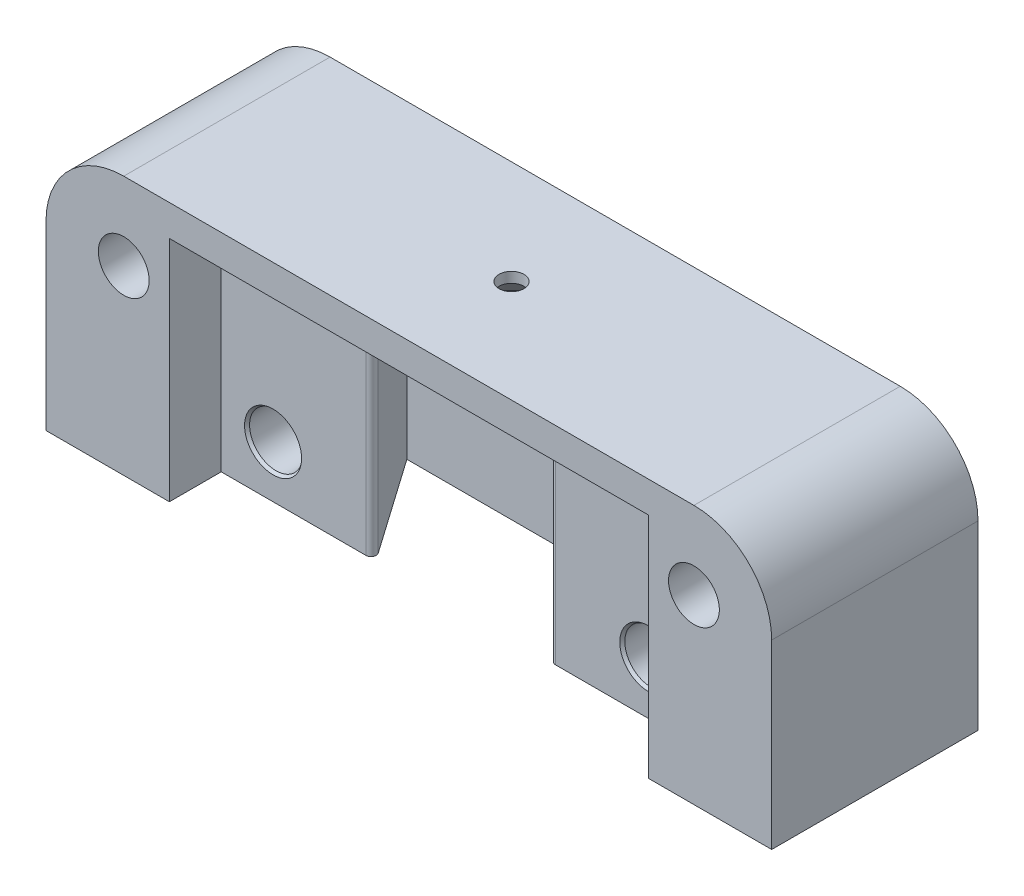
ISO-10303-21;
HEADER;
FILE_DESCRIPTION(('STEP AP214'),'2;1');
FILE_NAME('part.step','',(''),(''),'','','');
FILE_SCHEMA(('AUTOMOTIVE_DESIGN { 1 0 10303 214 1 1 1 1 }'));
ENDSEC;
DATA;
#1=APPLICATION_CONTEXT('core data for automotive mechanical design processes');
#2=APPLICATION_PROTOCOL_DEFINITION('international standard','automotive_design',2000,#1);
#3=PRODUCT_CONTEXT('',#1,'mechanical');
#4=PRODUCT('Part','Part','',(#3));
#5=PRODUCT_RELATED_PRODUCT_CATEGORY('part','',(#4));
#6=PRODUCT_DEFINITION_FORMATION('','',#4);
#7=PRODUCT_DEFINITION_CONTEXT('part definition',#1,'design');
#8=PRODUCT_DEFINITION('design','',#6,#7);
#9=PRODUCT_DEFINITION_SHAPE('','',#8);
#10=(LENGTH_UNIT() NAMED_UNIT(*) SI_UNIT(.MILLI.,.METRE.));
#11=(NAMED_UNIT(*) PLANE_ANGLE_UNIT() SI_UNIT($,.RADIAN.));
#12=(NAMED_UNIT(*) SI_UNIT($,.STERADIAN.) SOLID_ANGLE_UNIT());
#13=UNCERTAINTY_MEASURE_WITH_UNIT(LENGTH_MEASURE(1.E-05),#10,'distance_accuracy_value','');
#14=(GEOMETRIC_REPRESENTATION_CONTEXT(3) GLOBAL_UNCERTAINTY_ASSIGNED_CONTEXT((#13)) GLOBAL_UNIT_ASSIGNED_CONTEXT((#10,
#11,#12)) REPRESENTATION_CONTEXT('',''));
#15=CARTESIAN_POINT('',(0.,0.,0.));
#16=DIRECTION('',(0.,0.,1.));
#17=DIRECTION('',(1.,0.,0.));
#18=AXIS2_PLACEMENT_3D('',#15,#16,#17);
#19=CARTESIAN_POINT('',(0.,25.,4.9));
#20=DIRECTION('',(0.,0.,-1.));
#21=DIRECTION('',(-1.,0.,0.));
#22=AXIS2_PLACEMENT_3D('',#19,#20,#21);
#23=PLANE('',#22);
#24=CARTESIAN_POINT('',(18.0979246179028,5.,4.9));
#25=DIRECTION('',(0.,0.,1.));
#26=DIRECTION('',(1.,0.,0.));
#27=AXIS2_PLACEMENT_3D('',#24,#25,#26);
#28=CIRCLE('',#27,2.75);
#29=CARTESIAN_POINT('',(20.8479246179028,5.,4.9));
#30=VERTEX_POINT('',#29);
#31=EDGE_CURVE('E962',#30,#30,#28,.T.);
#32=ORIENTED_EDGE('',*,*,#31,.F.);
#33=EDGE_LOOP('',(#32));
#34=FACE_BOUND('',#33,.T.);
#35=DIRECTION('',(-1.,0.,0.));
#36=VECTOR('',#35,1.);
#37=CARTESIAN_POINT('',(0.,22.,4.9));
#38=LINE('',#37,#36);
#39=CARTESIAN_POINT('',(23.0979246179028,22.,4.9));
#40=VERTEX_POINT('',#39);
#41=CARTESIAN_POINT('',(9.15051389408554,22.,4.9));
#42=VERTEX_POINT('',#41);
#43=EDGE_CURVE('E182',#40,#42,#38,.T.);
#44=ORIENTED_EDGE('',*,*,#43,.T.);
#45=DIRECTION('',(0.,-1.,0.));
#46=VECTOR('',#45,1.);
#47=CARTESIAN_POINT('',(9.15051389408554,25.,4.9));
#48=LINE('',#47,#46);
#49=CARTESIAN_POINT('',(9.15051389408554,0.,4.9));
#50=VERTEX_POINT('',#49);
#51=EDGE_CURVE('E251',#42,#50,#48,.T.);
#52=ORIENTED_EDGE('',*,*,#51,.T.);
#53=DIRECTION('',(1.,0.,0.));
#54=VECTOR('',#53,1.);
#55=CARTESIAN_POINT('',(0.,0.,4.9));
#56=LINE('',#55,#54);
#57=CARTESIAN_POINT('',(23.0979246179028,0.,4.9));
#58=VERTEX_POINT('',#57);
#59=EDGE_CURVE('E316',#50,#58,#56,.T.);
#60=ORIENTED_EDGE('',*,*,#59,.T.);
#61=DIRECTION('',(0.,-1.,0.));
#62=VECTOR('',#61,1.);
#63=CARTESIAN_POINT('',(23.0979246179028,25.,4.9));
#64=LINE('',#63,#62);
#65=EDGE_CURVE('E212',#40,#58,#64,.T.);
#66=ORIENTED_EDGE('',*,*,#65,.F.);
#67=EDGE_LOOP('',(#44,#52,#60,#66));
#68=FACE_BOUND('',#67,.T.);
#69=ADVANCED_FACE('F44',(#34,#68),#23,.F.);
#70=CARTESIAN_POINT('',(23.0979246179028,25.,0.));
#71=DIRECTION('',(1.,0.,0.));
#72=DIRECTION('',(0.,0.,-1.));
#73=AXIS2_PLACEMENT_3D('',#70,#71,#72);
#74=PLANE('',#73);
#75=DIRECTION('',(0.,-1.,0.));
#76=VECTOR('',#75,1.);
#77=CARTESIAN_POINT('',(23.0979246179028,25.,9.9));
#78=LINE('',#77,#76);
#79=CARTESIAN_POINT('',(23.0979246179028,22.,9.9));
#80=VERTEX_POINT('',#79);
#81=CARTESIAN_POINT('',(23.0979246179028,0.,9.9));
#82=VERTEX_POINT('',#81);
#83=EDGE_CURVE('E209',#80,#82,#78,.T.);
#84=ORIENTED_EDGE('',*,*,#83,.F.);
#85=DIRECTION('',(0.,0.,-1.));
#86=VECTOR('',#85,1.);
#87=CARTESIAN_POINT('',(23.0979246179028,22.,0.));
#88=LINE('',#87,#86);
#89=EDGE_CURVE('E167',#80,#40,#88,.T.);
#90=ORIENTED_EDGE('',*,*,#89,.T.);
#91=ORIENTED_EDGE('',*,*,#65,.T.);
#92=DIRECTION('',(0.,0.,1.));
#93=VECTOR('',#92,1.);
#94=CARTESIAN_POINT('',(23.0979246179028,0.,0.));
#95=LINE('',#94,#93);
#96=EDGE_CURVE('E329',#58,#82,#95,.T.);
#97=ORIENTED_EDGE('',*,*,#96,.T.);
#98=EDGE_LOOP('',(#84,#90,#91,#97));
#99=FACE_BOUND('',#98,.T.);
#100=ADVANCED_FACE('F406',(#99),#74,.F.);
#101=CARTESIAN_POINT('',(35.,25.,0.));
#102=DIRECTION('',(-1.,0.,0.));
#103=DIRECTION('',(0.,0.,1.));
#104=AXIS2_PLACEMENT_3D('',#101,#102,#103);
#105=PLANE('',#104);
#106=DIRECTION('',(0.,-1.,0.));
#107=VECTOR('',#106,1.);
#108=CARTESIAN_POINT('',(35.,25.,-10.));
#109=LINE('',#108,#107);
#110=CARTESIAN_POINT('',(35.,17.5,-10.));
#111=VERTEX_POINT('',#110);
#112=CARTESIAN_POINT('',(35.,0.,-10.));
#113=VERTEX_POINT('',#112);
#114=EDGE_CURVE('E203',#111,#113,#109,.T.);
#115=ORIENTED_EDGE('',*,*,#114,.F.);
#116=DIRECTION('',(0.,0.,-1.));
#117=VECTOR('',#116,1.);
#118=CARTESIAN_POINT('',(35.,17.5,9.9));
#119=LINE('',#118,#117);
#120=CARTESIAN_POINT('',(35.,17.5,9.9));
#121=VERTEX_POINT('',#120);
#122=EDGE_CURVE('E242',#111,#121,#119,.F.);
#123=ORIENTED_EDGE('',*,*,#122,.T.);
#124=DIRECTION('',(0.,-1.,0.));
#125=VECTOR('',#124,1.);
#126=CARTESIAN_POINT('',(35.,25.,9.9));
#127=LINE('',#126,#125);
#128=CARTESIAN_POINT('',(35.,0.,9.9));
#129=VERTEX_POINT('',#128);
#130=EDGE_CURVE('E206',#121,#129,#127,.T.);
#131=ORIENTED_EDGE('',*,*,#130,.T.);
#132=DIRECTION('',(0.,0.,-1.));
#133=VECTOR('',#132,1.);
#134=CARTESIAN_POINT('',(35.,0.,0.));
#135=LINE('',#134,#133);
#136=EDGE_CURVE('E337',#129,#113,#135,.T.);
#137=ORIENTED_EDGE('',*,*,#136,.T.);
#138=EDGE_LOOP('',(#115,#123,#131,#137));
#139=FACE_BOUND('',#138,.T.);
#140=ADVANCED_FACE('F401',(#139),#105,.F.);
#141=CARTESIAN_POINT('',(0.,25.,-10.));
#142=DIRECTION('',(0.,0.,-1.));
#143=DIRECTION('',(-1.,0.,0.));
#144=AXIS2_PLACEMENT_3D('',#141,#142,#143);
#145=PLANE('',#144);
#146=CARTESIAN_POINT('',(27.5,17.5,-10.));
#147=DIRECTION('',(0.,0.,-1.));
#148=DIRECTION('',(-1.,0.,0.));
#149=AXIS2_PLACEMENT_3D('',#146,#147,#148);
#150=CIRCLE('',#149,6.10000000000699);
#151=CARTESIAN_POINT('',(21.399999999993,17.5,-10.));
#152=VERTEX_POINT('',#151);
#153=EDGE_CURVE('E48',#152,#152,#150,.F.);
#154=ORIENTED_EDGE('',*,*,#153,.T.);
#155=EDGE_LOOP('',(#154));
#156=FACE_BOUND('',#155,.T.);
#157=CARTESIAN_POINT('',(-27.5,17.5,-10.));
#158=DIRECTION('',(0.,0.,-1.));
#159=DIRECTION('',(-1.,0.,0.));
#160=AXIS2_PLACEMENT_3D('',#157,#158,#159);
#161=CIRCLE('',#160,6.1);
#162=CARTESIAN_POINT('',(-33.6,17.5,-10.));
#163=VERTEX_POINT('',#162);
#164=EDGE_CURVE('E275',#163,#163,#161,.F.);
#165=ORIENTED_EDGE('',*,*,#164,.T.);
#166=EDGE_LOOP('',(#165));
#167=FACE_BOUND('',#166,.T.);
#168=CARTESIAN_POINT('',(-27.5,17.5,-10.));
#169=DIRECTION('',(0.,0.,-1.));
#170=DIRECTION('',(-1.,0.,0.));
#171=AXIS2_PLACEMENT_3D('',#168,#169,#170);
#172=CIRCLE('',#171,7.5);
#173=CARTESIAN_POINT('',(-35.,17.5,-10.));
#174=VERTEX_POINT('',#173);
#175=CARTESIAN_POINT('',(-27.5,25.,-10.));
#176=VERTEX_POINT('',#175);
#177=EDGE_CURVE('E228',#174,#176,#172,.T.);
#178=ORIENTED_EDGE('',*,*,#177,.T.);
#179=DIRECTION('',(1.,0.,0.));
#180=VECTOR('',#179,1.);
#181=CARTESIAN_POINT('',(0.,25.,-10.));
#182=LINE('',#181,#180);
#183=CARTESIAN_POINT('',(27.5,25.,-10.));
#184=VERTEX_POINT('',#183);
#185=EDGE_CURVE('E321',#176,#184,#182,.T.);
#186=ORIENTED_EDGE('',*,*,#185,.T.);
#187=CARTESIAN_POINT('',(27.5,17.5,-10.));
#188=DIRECTION('',(0.,0.,-1.));
#189=DIRECTION('',(-1.,0.,0.));
#190=AXIS2_PLACEMENT_3D('',#187,#188,#189);
#191=CIRCLE('',#190,7.5);
#192=EDGE_CURVE('E225',#184,#111,#191,.T.);
#193=ORIENTED_EDGE('',*,*,#192,.T.);
#194=ORIENTED_EDGE('',*,*,#114,.T.);
#195=DIRECTION('',(1.,0.,0.));
#196=VECTOR('',#195,1.);
#197=CARTESIAN_POINT('',(0.,0.,-10.));
#198=LINE('',#197,#196);
#199=CARTESIAN_POINT('',(-35.,0.,-10.));
#200=VERTEX_POINT('',#199);
#201=EDGE_CURVE('E341',#200,#113,#198,.T.);
#202=ORIENTED_EDGE('',*,*,#201,.F.);
#203=DIRECTION('',(0.,-1.,0.));
#204=VECTOR('',#203,1.);
#205=CARTESIAN_POINT('',(-35.,25.,-10.));
#206=LINE('',#205,#204);
#207=EDGE_CURVE('E195',#174,#200,#206,.T.);
#208=ORIENTED_EDGE('',*,*,#207,.F.);
#209=EDGE_LOOP('',(#178,#186,#193,#194,#202,#208));
#210=FACE_BOUND('',#209,.T.);
#211=ADVANCED_FACE('F395',(#156,#167,#210),#145,.T.);
#212=CARTESIAN_POINT('',(-35.,25.,0.));
#213=DIRECTION('',(-1.,0.,0.));
#214=DIRECTION('',(0.,0.,1.));
#215=AXIS2_PLACEMENT_3D('',#212,#213,#214);
#216=PLANE('',#215);
#217=DIRECTION('',(0.,-1.,0.));
#218=VECTOR('',#217,1.);
#219=CARTESIAN_POINT('',(-35.,25.,9.9));
#220=LINE('',#219,#218);
#221=CARTESIAN_POINT('',(-35.,17.5,9.9));
#222=VERTEX_POINT('',#221);
#223=CARTESIAN_POINT('',(-35.,0.,9.9));
#224=VERTEX_POINT('',#223);
#225=EDGE_CURVE('E191',#222,#224,#220,.T.);
#226=ORIENTED_EDGE('',*,*,#225,.F.);
#227=DIRECTION('',(0.,0.,-1.));
#228=VECTOR('',#227,1.);
#229=CARTESIAN_POINT('',(-35.,17.5,0.));
#230=LINE('',#229,#228);
#231=EDGE_CURVE('E216',#222,#174,#230,.T.);
#232=ORIENTED_EDGE('',*,*,#231,.T.);
#233=ORIENTED_EDGE('',*,*,#207,.T.);
#234=DIRECTION('',(0.,0.,-1.));
#235=VECTOR('',#234,1.);
#236=CARTESIAN_POINT('',(-35.,0.,0.));
#237=LINE('',#236,#235);
#238=EDGE_CURVE('E345',#224,#200,#237,.T.);
#239=ORIENTED_EDGE('',*,*,#238,.F.);
#240=EDGE_LOOP('',(#226,#232,#233,#239));
#241=FACE_BOUND('',#240,.T.);
#242=ADVANCED_FACE('F390',(#241),#216,.T.);
#243=CARTESIAN_POINT('',(0.,25.,9.9));
#244=DIRECTION('',(0.,0.,-1.));
#245=DIRECTION('',(-1.,0.,0.));
#246=AXIS2_PLACEMENT_3D('',#243,#244,#245);
#247=PLANE('',#246);
#248=DIRECTION('',(1.,0.,0.));
#249=VECTOR('',#248,1.);
#250=CARTESIAN_POINT('',(0.,25.,9.9));
#251=LINE('',#250,#249);
#252=CARTESIAN_POINT('',(-27.5,25.,9.9));
#253=VERTEX_POINT('',#252);
#254=CARTESIAN_POINT('',(27.5,25.,9.9));
#255=VERTEX_POINT('',#254);
#256=EDGE_CURVE('E317',#253,#255,#251,.T.);
#257=ORIENTED_EDGE('',*,*,#256,.F.);
#258=CARTESIAN_POINT('',(-27.5,17.5,9.9));
#259=DIRECTION('',(0.,0.,-1.));
#260=DIRECTION('',(-1.,0.,0.));
#261=AXIS2_PLACEMENT_3D('',#258,#259,#260);
#262=CIRCLE('',#261,7.5);
#263=EDGE_CURVE('E239',#253,#222,#262,.F.);
#264=ORIENTED_EDGE('',*,*,#263,.T.);
#265=ORIENTED_EDGE('',*,*,#225,.T.);
#266=DIRECTION('',(1.,0.,0.));
#267=VECTOR('',#266,1.);
#268=CARTESIAN_POINT('',(0.,0.,9.9));
#269=LINE('',#268,#267);
#270=CARTESIAN_POINT('',(-23.0979246179028,0.,9.9));
#271=VERTEX_POINT('',#270);
#272=EDGE_CURVE('E188',#224,#271,#269,.T.);
#273=ORIENTED_EDGE('',*,*,#272,.T.);
#274=DIRECTION('',(0.,-1.,0.));
#275=VECTOR('',#274,1.);
#276=CARTESIAN_POINT('',(-23.0979246179028,25.,9.9));
#277=LINE('',#276,#275);
#278=CARTESIAN_POINT('',(-23.0979246179028,22.,9.9));
#279=VERTEX_POINT('',#278);
#280=EDGE_CURVE('E178',#279,#271,#277,.T.);
#281=ORIENTED_EDGE('',*,*,#280,.F.);
#282=DIRECTION('',(1.,0.,0.));
#283=VECTOR('',#282,1.);
#284=CARTESIAN_POINT('',(-27.5,22.,9.9));
#285=LINE('',#284,#283);
#286=EDGE_CURVE('E161',#279,#80,#285,.T.);
#287=ORIENTED_EDGE('',*,*,#286,.T.);
#288=ORIENTED_EDGE('',*,*,#83,.T.);
#289=DIRECTION('',(1.,0.,0.));
#290=VECTOR('',#289,1.);
#291=CARTESIAN_POINT('',(0.,0.,9.9));
#292=LINE('',#291,#290);
#293=EDGE_CURVE('E333',#82,#129,#292,.T.);
#294=ORIENTED_EDGE('',*,*,#293,.T.);
#295=ORIENTED_EDGE('',*,*,#130,.F.);
#296=CARTESIAN_POINT('',(27.5,17.5,9.9));
#297=DIRECTION('',(0.,0.,-1.));
#298=DIRECTION('',(-1.,0.,0.));
#299=AXIS2_PLACEMENT_3D('',#296,#297,#298);
#300=CIRCLE('',#299,7.5);
#301=EDGE_CURVE('E245',#121,#255,#300,.F.);
#302=ORIENTED_EDGE('',*,*,#301,.T.);
#303=EDGE_LOOP('',(#257,#264,#265,#273,#281,#287,#288,#294,#295,#302));
#304=FACE_BOUND('',#303,.T.);
#305=CARTESIAN_POINT('',(-27.5,17.5,9.9));
#306=DIRECTION('',(0.,0.,-1.));
#307=DIRECTION('',(-1.,0.,0.));
#308=AXIS2_PLACEMENT_3D('',#305,#306,#307);
#309=CIRCLE('',#308,2.45);
#310=CARTESIAN_POINT('',(-29.95,17.5,9.9));
#311=VERTEX_POINT('',#310);
#312=EDGE_CURVE('E217',#311,#311,#309,.T.);
#313=ORIENTED_EDGE('',*,*,#312,.T.);
#314=EDGE_LOOP('',(#313));
#315=FACE_BOUND('',#314,.T.);
#316=CARTESIAN_POINT('',(27.5,17.5,9.9));
#317=DIRECTION('',(0.,0.,-1.));
#318=DIRECTION('',(-1.,0.,0.));
#319=AXIS2_PLACEMENT_3D('',#316,#317,#318);
#320=CIRCLE('',#319,2.45);
#321=CARTESIAN_POINT('',(25.05,17.5,9.9));
#322=VERTEX_POINT('',#321);
#323=EDGE_CURVE('E221',#322,#322,#320,.T.);
#324=ORIENTED_EDGE('',*,*,#323,.T.);
#325=EDGE_LOOP('',(#324));
#326=FACE_BOUND('',#325,.T.);
#327=ADVANCED_FACE('F185',(#304,#315,#326),#247,.F.);
#328=CARTESIAN_POINT('',(-23.0979246179028,25.,0.));
#329=DIRECTION('',(-1.,0.,0.));
#330=DIRECTION('',(0.,0.,1.));
#331=AXIS2_PLACEMENT_3D('',#328,#329,#330);
#332=PLANE('',#331);
#333=DIRECTION('',(0.,-1.,0.));
#334=VECTOR('',#333,1.);
#335=CARTESIAN_POINT('',(-23.0979246179028,25.,4.9));
#336=LINE('',#335,#334);
#337=CARTESIAN_POINT('',(-23.0979246179028,22.,4.9));
#338=VERTEX_POINT('',#337);
#339=CARTESIAN_POINT('',(-23.0979246179028,0.,4.9));
#340=VERTEX_POINT('',#339);
#341=EDGE_CURVE('E180',#338,#340,#336,.T.);
#342=ORIENTED_EDGE('',*,*,#341,.F.);
#343=DIRECTION('',(0.,0.,1.));
#344=VECTOR('',#343,1.);
#345=CARTESIAN_POINT('',(-23.0979246179028,22.,0.));
#346=LINE('',#345,#344);
#347=EDGE_CURVE('E164',#338,#279,#346,.T.);
#348=ORIENTED_EDGE('',*,*,#347,.T.);
#349=ORIENTED_EDGE('',*,*,#280,.T.);
#350=DIRECTION('',(0.,0.,-1.));
#351=VECTOR('',#350,1.);
#352=CARTESIAN_POINT('',(-23.0979246179028,0.,0.));
#353=LINE('',#352,#351);
#354=EDGE_CURVE('E351',#271,#340,#353,.T.);
#355=ORIENTED_EDGE('',*,*,#354,.T.);
#356=EDGE_LOOP('',(#342,#348,#349,#355));
#357=FACE_BOUND('',#356,.T.);
#358=ADVANCED_FACE('F176',(#357),#332,.F.);
#359=CARTESIAN_POINT('',(0.,25.,4.9));
#360=DIRECTION('',(0.,0.,-1.));
#361=DIRECTION('',(-1.,0.,0.));
#362=AXIS2_PLACEMENT_3D('',#359,#360,#361);
#363=PLANE('',#362);
#364=CARTESIAN_POINT('',(-18.0979246179028,5.,4.9));
#365=DIRECTION('',(0.,0.,1.));
#366=DIRECTION('',(1.,0.,0.));
#367=AXIS2_PLACEMENT_3D('',#364,#365,#366);
#368=CIRCLE('',#367,2.75);
#369=CARTESIAN_POINT('',(-15.3479246179028,5.,4.9));
#370=VERTEX_POINT('',#369);
#371=EDGE_CURVE('E974',#370,#370,#368,.T.);
#372=ORIENTED_EDGE('',*,*,#371,.F.);
#373=EDGE_LOOP('',(#372));
#374=FACE_BOUND('',#373,.T.);
#375=DIRECTION('',(1.,0.,0.));
#376=VECTOR('',#375,1.);
#377=CARTESIAN_POINT('',(0.,0.,4.9));
#378=LINE('',#377,#376);
#379=CARTESIAN_POINT('',(-9.15051389408553,0.,4.9));
#380=VERTEX_POINT('',#379);
#381=EDGE_CURVE('E354',#340,#380,#378,.T.);
#382=ORIENTED_EDGE('',*,*,#381,.T.);
#383=DIRECTION('',(0.,-1.,0.));
#384=VECTOR('',#383,1.);
#385=CARTESIAN_POINT('',(-9.15051389408553,22.,4.9));
#386=LINE('',#385,#384);
#387=CARTESIAN_POINT('',(-9.15051389408553,22.,4.9));
#388=VERTEX_POINT('',#387);
#389=EDGE_CURVE('E62',#380,#388,#386,.F.);
#390=ORIENTED_EDGE('',*,*,#389,.T.);
#391=DIRECTION('',(-1.,0.,0.));
#392=VECTOR('',#391,1.);
#393=CARTESIAN_POINT('',(0.,22.,4.9));
#394=LINE('',#393,#392);
#395=EDGE_CURVE('E183',#388,#338,#394,.T.);
#396=ORIENTED_EDGE('',*,*,#395,.T.);
#397=ORIENTED_EDGE('',*,*,#341,.T.);
#398=EDGE_LOOP('',(#382,#390,#396,#397));
#399=FACE_BOUND('',#398,.T.);
#400=ADVANCED_FACE('F386',(#374,#399),#363,.F.);
#401=CARTESIAN_POINT('',(-7.79783472740656,25.,5.46010265784359));
#402=DIRECTION('',(0.819152044288989,0.,-0.57357643635105));
#403=DIRECTION('',(-0.57357643635105,0.,-0.819152044288989));
#404=AXIS2_PLACEMENT_3D('',#401,#402,#403);
#405=PLANE('',#404);
#406=DIRECTION('',(-0.57357643635105,0.,-0.819152044288989));
#407=VECTOR('',#406,1.);
#408=CARTESIAN_POINT('',(-7.79783472740656,22.,5.46010265784359));
#409=LINE('',#408,#407);
#410=CARTESIAN_POINT('',(-8.74093787194103,22.,4.11321178182448));
#411=VERTEX_POINT('',#410);
#412=CARTESIAN_POINT('',(-15.1920982126971,22.,-5.1));
#413=VERTEX_POINT('',#412);
#414=EDGE_CURVE('E303',#411,#413,#409,.T.);
#415=ORIENTED_EDGE('',*,*,#414,.F.);
#416=DIRECTION('',(0.,-1.,0.));
#417=VECTOR('',#416,1.);
#418=CARTESIAN_POINT('',(-8.74093787194103,0.,4.11321178182448));
#419=LINE('',#418,#417);
#420=CARTESIAN_POINT('',(-8.74093787194103,0.,4.11321178182448));
#421=VERTEX_POINT('',#420);
#422=EDGE_CURVE('E268',#411,#421,#419,.T.);
#423=ORIENTED_EDGE('',*,*,#422,.T.);
#424=DIRECTION('',(0.57357643635105,0.,0.819152044288989));
#425=VECTOR('',#424,1.);
#426=CARTESIAN_POINT('',(-7.79783472740656,0.,5.46010265784359));
#427=LINE('',#426,#425);
#428=CARTESIAN_POINT('',(-15.1920982126971,0.,-5.1));
#429=VERTEX_POINT('',#428);
#430=EDGE_CURVE('E357',#429,#421,#427,.T.);
#431=ORIENTED_EDGE('',*,*,#430,.F.);
#432=DIRECTION('',(0.,-1.,0.));
#433=VECTOR('',#432,1.);
#434=CARTESIAN_POINT('',(-15.1920982126971,25.,-5.1));
#435=LINE('',#434,#433);
#436=EDGE_CURVE('E197',#413,#429,#435,.T.);
#437=ORIENTED_EDGE('',*,*,#436,.F.);
#438=EDGE_LOOP('',(#415,#423,#431,#437));
#439=FACE_BOUND('',#438,.T.);
#440=ADVANCED_FACE('F382',(#439),#405,.T.);
#441=CARTESIAN_POINT('',(0.,25.,-5.1));
#442=DIRECTION('',(0.,0.,-1.));
#443=DIRECTION('',(-1.,0.,0.));
#444=AXIS2_PLACEMENT_3D('',#441,#442,#443);
#445=PLANE('',#444);
#446=DIRECTION('',(0.,-1.,0.));
#447=VECTOR('',#446,1.);
#448=CARTESIAN_POINT('',(15.1920982126971,25.,-5.1));
#449=LINE('',#448,#447);
#450=CARTESIAN_POINT('',(15.1920982126971,22.,-5.1));
#451=VERTEX_POINT('',#450);
#452=CARTESIAN_POINT('',(15.1920982126971,0.,-5.1));
#453=VERTEX_POINT('',#452);
#454=EDGE_CURVE('E326',#451,#453,#449,.T.);
#455=ORIENTED_EDGE('',*,*,#454,.F.);
#456=DIRECTION('',(-1.,0.,0.));
#457=VECTOR('',#456,1.);
#458=CARTESIAN_POINT('',(0.,22.,-5.1));
#459=LINE('',#458,#457);
#460=EDGE_CURVE('E172',#451,#413,#459,.T.);
#461=ORIENTED_EDGE('',*,*,#460,.T.);
#462=ORIENTED_EDGE('',*,*,#436,.T.);
#463=DIRECTION('',(1.,0.,0.));
#464=VECTOR('',#463,1.);
#465=CARTESIAN_POINT('',(0.,0.,-5.1));
#466=LINE('',#465,#464);
#467=EDGE_CURVE('E361',#429,#453,#466,.T.);
#468=ORIENTED_EDGE('',*,*,#467,.T.);
#469=EDGE_LOOP('',(#455,#461,#462,#468));
#470=FACE_BOUND('',#469,.T.);
#471=ADVANCED_FACE('F374',(#470),#445,.F.);
#472=CARTESIAN_POINT('',(7.79783472740657,25.,5.46010265784359));
#473=DIRECTION('',(0.819152044288989,0.,0.57357643635105));
#474=DIRECTION('',(0.57357643635105,0.,-0.819152044288989));
#475=AXIS2_PLACEMENT_3D('',#472,#473,#474);
#476=PLANE('',#475);
#477=DIRECTION('',(-0.57357643635105,0.,0.819152044288989));
#478=VECTOR('',#477,1.);
#479=CARTESIAN_POINT('',(7.79783472740657,0.,5.46010265784359));
#480=LINE('',#479,#478);
#481=CARTESIAN_POINT('',(8.74093787194104,0.,4.11321178182448));
#482=VERTEX_POINT('',#481);
#483=EDGE_CURVE('E322',#453,#482,#480,.T.);
#484=ORIENTED_EDGE('',*,*,#483,.T.);
#485=DIRECTION('',(0.,-1.,0.));
#486=VECTOR('',#485,1.);
#487=CARTESIAN_POINT('',(8.74093787194104,25.,4.11321178182448));
#488=LINE('',#487,#486);
#489=CARTESIAN_POINT('',(8.74093787194104,22.,4.11321178182448));
#490=VERTEX_POINT('',#489);
#491=EDGE_CURVE('E265',#482,#490,#488,.F.);
#492=ORIENTED_EDGE('',*,*,#491,.T.);
#493=DIRECTION('',(0.57357643635105,0.,-0.819152044288989));
#494=VECTOR('',#493,1.);
#495=CARTESIAN_POINT('',(7.79783472740657,22.,5.46010265784359));
#496=LINE('',#495,#494);
#497=EDGE_CURVE('E248',#490,#451,#496,.T.);
#498=ORIENTED_EDGE('',*,*,#497,.T.);
#499=ORIENTED_EDGE('',*,*,#454,.T.);
#500=EDGE_LOOP('',(#484,#492,#498,#499));
#501=FACE_BOUND('',#500,.T.);
#502=ADVANCED_FACE('F416',(#501),#476,.F.);
#503=CARTESIAN_POINT('',(0.,25.,0.));
#504=DIRECTION('',(0.,1.,0.));
#505=DIRECTION('',(0.,0.,1.));
#506=AXIS2_PLACEMENT_3D('',#503,#504,#505);
#507=PLANE('',#506);
#508=CARTESIAN_POINT('',(0.,25.,0.));
#509=DIRECTION('',(0.,1.,0.));
#510=DIRECTION('',(0.,0.,1.));
#511=AXIS2_PLACEMENT_3D('',#508,#509,#510);
#512=CIRCLE('',#511,1.2);
#513=CARTESIAN_POINT('',(0.,25.,1.2));
#514=VERTEX_POINT('',#513);
#515=EDGE_CURVE('E173',#514,#514,#512,.T.);
#516=ORIENTED_EDGE('',*,*,#515,.F.);
#517=EDGE_LOOP('',(#516));
#518=FACE_BOUND('',#517,.T.);
#519=DIRECTION('',(0.,0.,-1.));
#520=VECTOR('',#519,1.);
#521=CARTESIAN_POINT('',(-27.5,25.,0.));
#522=LINE('',#521,#520);
#523=EDGE_CURVE('E235',#176,#253,#522,.F.);
#524=ORIENTED_EDGE('',*,*,#523,.T.);
#525=ORIENTED_EDGE('',*,*,#256,.T.);
#526=DIRECTION('',(0.,0.,-1.));
#527=VECTOR('',#526,1.);
#528=CARTESIAN_POINT('',(27.5,25.,-10.));
#529=LINE('',#528,#527);
#530=EDGE_CURVE('E231',#255,#184,#529,.T.);
#531=ORIENTED_EDGE('',*,*,#530,.T.);
#532=ORIENTED_EDGE('',*,*,#185,.F.);
#533=EDGE_LOOP('',(#524,#525,#531,#532));
#534=FACE_BOUND('',#533,.T.);
#535=ADVANCED_FACE('F418',(#518,#534),#507,.T.);
#536=CARTESIAN_POINT('',(0.,0.,0.));
#537=DIRECTION('',(0.,1.,0.));
#538=DIRECTION('',(0.,0.,1.));
#539=AXIS2_PLACEMENT_3D('',#536,#537,#538);
#540=PLANE('',#539);
#541=ORIENTED_EDGE('',*,*,#59,.F.);
#542=CARTESIAN_POINT('',(9.15051389408554,0.,4.4));
#543=DIRECTION('',(0.,1.,0.));
#544=DIRECTION('',(0.,0.,1.));
#545=AXIS2_PLACEMENT_3D('',#542,#543,#544);
#546=CIRCLE('',#545,0.5);
#547=EDGE_CURVE('E262',#50,#482,#546,.F.);
#548=ORIENTED_EDGE('',*,*,#547,.T.);
#549=ORIENTED_EDGE('',*,*,#483,.F.);
#550=ORIENTED_EDGE('',*,*,#467,.F.);
#551=ORIENTED_EDGE('',*,*,#430,.T.);
#552=CARTESIAN_POINT('',(-9.15051389408553,0.,4.4));
#553=DIRECTION('',(0.,1.,0.));
#554=DIRECTION('',(0.,0.,1.));
#555=AXIS2_PLACEMENT_3D('',#552,#553,#554);
#556=CIRCLE('',#555,0.5);
#557=EDGE_CURVE('E259',#421,#380,#556,.F.);
#558=ORIENTED_EDGE('',*,*,#557,.T.);
#559=ORIENTED_EDGE('',*,*,#381,.F.);
#560=ORIENTED_EDGE('',*,*,#354,.F.);
#561=ORIENTED_EDGE('',*,*,#272,.F.);
#562=ORIENTED_EDGE('',*,*,#238,.T.);
#563=ORIENTED_EDGE('',*,*,#201,.T.);
#564=ORIENTED_EDGE('',*,*,#136,.F.);
#565=ORIENTED_EDGE('',*,*,#293,.F.);
#566=ORIENTED_EDGE('',*,*,#96,.F.);
#567=EDGE_LOOP('',(#541,#548,#549,#550,#551,#558,#559,#560,#561,#562,#563,#564,#565,#566));
#568=FACE_BOUND('',#567,.T.);
#569=ADVANCED_FACE('F381',(#568),#540,.F.);
#570=CARTESIAN_POINT('',(-27.5,17.5,15.));
#571=DIRECTION('',(0.,0.,-1.));
#572=DIRECTION('',(-1.,0.,0.));
#573=AXIS2_PLACEMENT_3D('',#570,#571,#572);
#574=CYLINDRICAL_SURFACE('',#573,2.45);
#575=CARTESIAN_POINT('',(-27.5,17.5,-9.9933116161619));
#576=DIRECTION('',(0.,0.,1.));
#577=DIRECTION('',(1.,0.,0.));
#578=AXIS2_PLACEMENT_3D('',#575,#576,#577);
#579=CIRCLE('',#578,2.45);
#580=CARTESIAN_POINT('',(-25.05,17.5,-9.9933116161619));
#581=VERTEX_POINT('',#580);
#582=EDGE_CURVE('E293',#581,#581,#579,.T.);
#583=ORIENTED_EDGE('',*,*,#582,.F.);
#584=EDGE_LOOP('',(#583));
#585=FACE_BOUND('',#584,.T.);
#586=ORIENTED_EDGE('',*,*,#312,.F.);
#587=EDGE_LOOP('',(#586));
#588=FACE_BOUND('',#587,.T.);
#589=ADVANCED_FACE('F471',(#585,#588),#574,.F.);
#590=CARTESIAN_POINT('',(27.5,17.5,15.));
#591=DIRECTION('',(0.,0.,-1.));
#592=DIRECTION('',(-1.,0.,0.));
#593=AXIS2_PLACEMENT_3D('',#590,#591,#592);
#594=CYLINDRICAL_SURFACE('',#593,2.45);
#595=CARTESIAN_POINT('',(27.5,17.5,-9.9933116161619));
#596=DIRECTION('',(0.,0.,1.));
#597=DIRECTION('',(1.,0.,0.));
#598=AXIS2_PLACEMENT_3D('',#595,#596,#597);
#599=CIRCLE('',#598,2.44999999999993);
#600=CARTESIAN_POINT('',(29.9499999999999,17.5,-9.9933116161619));
#601=VERTEX_POINT('',#600);
#602=EDGE_CURVE('E884',#601,#601,#599,.T.);
#603=ORIENTED_EDGE('',*,*,#602,.F.);
#604=EDGE_LOOP('',(#603));
#605=FACE_BOUND('',#604,.T.);
#606=ORIENTED_EDGE('',*,*,#323,.F.);
#607=EDGE_LOOP('',(#606));
#608=FACE_BOUND('',#607,.T.);
#609=ADVANCED_FACE('F442',(#605,#608),#594,.F.);
#610=CARTESIAN_POINT('',(-27.5,17.5,0.));
#611=DIRECTION('',(0.,0.,-1.));
#612=DIRECTION('',(-1.,0.,0.));
#613=AXIS2_PLACEMENT_3D('',#610,#611,#612);
#614=CYLINDRICAL_SURFACE('',#613,7.5);
#615=ORIENTED_EDGE('',*,*,#263,.F.);
#616=ORIENTED_EDGE('',*,*,#523,.F.);
#617=ORIENTED_EDGE('',*,*,#177,.F.);
#618=ORIENTED_EDGE('',*,*,#231,.F.);
#619=EDGE_LOOP('',(#615,#616,#617,#618));
#620=FACE_BOUND('',#619,.T.);
#621=ADVANCED_FACE('F438',(#620),#614,.T.);
#622=CARTESIAN_POINT('',(27.5,17.5,0.));
#623=DIRECTION('',(0.,0.,1.));
#624=DIRECTION('',(1.,0.,0.));
#625=AXIS2_PLACEMENT_3D('',#622,#623,#624);
#626=CYLINDRICAL_SURFACE('',#625,7.5);
#627=ORIENTED_EDGE('',*,*,#301,.F.);
#628=ORIENTED_EDGE('',*,*,#122,.F.);
#629=ORIENTED_EDGE('',*,*,#192,.F.);
#630=ORIENTED_EDGE('',*,*,#530,.F.);
#631=EDGE_LOOP('',(#627,#628,#629,#630));
#632=FACE_BOUND('',#631,.T.);
#633=ADVANCED_FACE('F441',(#632),#626,.T.);
#634=CARTESIAN_POINT('',(0.,22.,0.));
#635=DIRECTION('',(0.,-1.,0.));
#636=DIRECTION('',(0.,0.,-1.));
#637=AXIS2_PLACEMENT_3D('',#634,#635,#636);
#638=PLANE('',#637);
#639=CARTESIAN_POINT('',(0.,22.,0.));
#640=DIRECTION('',(0.,-1.,0.));
#641=DIRECTION('',(0.,0.,-1.));
#642=AXIS2_PLACEMENT_3D('',#639,#640,#641);
#643=CIRCLE('',#642,3.2);
#644=CARTESIAN_POINT('',(0.,22.,-3.2));
#645=VERTEX_POINT('',#644);
#646=EDGE_CURVE('E278',#645,#645,#643,.T.);
#647=ORIENTED_EDGE('',*,*,#646,.F.);
#648=EDGE_LOOP('',(#647));
#649=FACE_BOUND('',#648,.T.);
#650=ORIENTED_EDGE('',*,*,#89,.F.);
#651=ORIENTED_EDGE('',*,*,#286,.F.);
#652=ORIENTED_EDGE('',*,*,#347,.F.);
#653=ORIENTED_EDGE('',*,*,#395,.F.);
#654=CARTESIAN_POINT('',(-9.15051389408553,22.,4.4));
#655=DIRECTION('',(0.,-1.,0.));
#656=DIRECTION('',(0.,0.,-1.));
#657=AXIS2_PLACEMENT_3D('',#654,#655,#656);
#658=CIRCLE('',#657,0.5);
#659=EDGE_CURVE('E11',#388,#411,#658,.F.);
#660=ORIENTED_EDGE('',*,*,#659,.T.);
#661=ORIENTED_EDGE('',*,*,#414,.T.);
#662=ORIENTED_EDGE('',*,*,#460,.F.);
#663=ORIENTED_EDGE('',*,*,#497,.F.);
#664=CARTESIAN_POINT('',(9.15051389408554,22.,4.4));
#665=DIRECTION('',(0.,-1.,0.));
#666=DIRECTION('',(0.,0.,-1.));
#667=AXIS2_PLACEMENT_3D('',#664,#665,#666);
#668=CIRCLE('',#667,0.5);
#669=EDGE_CURVE('E54',#490,#42,#668,.F.);
#670=ORIENTED_EDGE('',*,*,#669,.T.);
#671=ORIENTED_EDGE('',*,*,#43,.F.);
#672=EDGE_LOOP('',(#650,#651,#652,#653,#660,#661,#662,#663,#670,#671));
#673=FACE_BOUND('',#672,.T.);
#674=ADVANCED_FACE('F163',(#649,#673),#638,.T.);
#675=CARTESIAN_POINT('',(0.,22.,0.));
#676=DIRECTION('',(0.,-1.,0.));
#677=DIRECTION('',(0.,0.,-1.));
#678=AXIS2_PLACEMENT_3D('',#675,#676,#677);
#679=CYLINDRICAL_SURFACE('',#678,1.2);
#680=ORIENTED_EDGE('',*,*,#515,.T.);
#681=EDGE_LOOP('',(#680));
#682=FACE_BOUND('',#681,.T.);
#683=CARTESIAN_POINT('',(0.,24.,0.));
#684=DIRECTION('',(0.,-1.,0.));
#685=DIRECTION('',(0.,0.,-1.));
#686=AXIS2_PLACEMENT_3D('',#683,#684,#685);
#687=CIRCLE('',#686,1.2);
#688=CARTESIAN_POINT('',(0.,24.,-1.2));
#689=VERTEX_POINT('',#688);
#690=EDGE_CURVE('E255',#689,#689,#687,.T.);
#691=ORIENTED_EDGE('',*,*,#690,.T.);
#692=EDGE_LOOP('',(#691));
#693=FACE_BOUND('',#692,.T.);
#694=ADVANCED_FACE('F453',(#682,#693),#679,.F.);
#695=CARTESIAN_POINT('',(0.,22.,0.));
#696=DIRECTION('',(0.,-1.,0.));
#697=DIRECTION('',(0.,0.,-1.));
#698=AXIS2_PLACEMENT_3D('',#695,#696,#697);
#699=CONICAL_SURFACE('',#698,3.2,0.785398163397449);
#700=ORIENTED_EDGE('',*,*,#690,.F.);
#701=EDGE_LOOP('',(#700));
#702=FACE_BOUND('',#701,.T.);
#703=ORIENTED_EDGE('',*,*,#646,.T.);
#704=EDGE_LOOP('',(#703));
#705=FACE_BOUND('',#704,.T.);
#706=ADVANCED_FACE('F447',(#702,#705),#699,.F.);
#707=CARTESIAN_POINT('',(9.15051389408554,25.,4.4));
#708=DIRECTION('',(0.,-1.,0.));
#709=DIRECTION('',(0.,0.,-1.));
#710=AXIS2_PLACEMENT_3D('',#707,#708,#709);
#711=CYLINDRICAL_SURFACE('',#710,0.5);
#712=ORIENTED_EDGE('',*,*,#669,.F.);
#713=ORIENTED_EDGE('',*,*,#491,.F.);
#714=ORIENTED_EDGE('',*,*,#547,.F.);
#715=ORIENTED_EDGE('',*,*,#51,.F.);
#716=EDGE_LOOP('',(#712,#713,#714,#715));
#717=FACE_BOUND('',#716,.T.);
#718=ADVANCED_FACE('F412',(#717),#711,.T.);
#719=CARTESIAN_POINT('',(-9.15051389408553,25.,4.4));
#720=DIRECTION('',(0.,1.,0.));
#721=DIRECTION('',(0.,0.,1.));
#722=AXIS2_PLACEMENT_3D('',#719,#720,#721);
#723=CYLINDRICAL_SURFACE('',#722,0.5);
#724=ORIENTED_EDGE('',*,*,#659,.F.);
#725=ORIENTED_EDGE('',*,*,#389,.F.);
#726=ORIENTED_EDGE('',*,*,#557,.F.);
#727=ORIENTED_EDGE('',*,*,#422,.F.);
#728=EDGE_LOOP('',(#724,#725,#726,#727));
#729=FACE_BOUND('',#728,.T.);
#730=ADVANCED_FACE('F46',(#729),#723,.T.);
#731=CARTESIAN_POINT('',(-27.5,17.5,-6.05248104938427));
#732=DIRECTION('',(0.,0.,-1.));
#733=DIRECTION('',(-1.,0.,0.));
#734=AXIS2_PLACEMENT_3D('',#731,#732,#733);
#735=CONICAL_SURFACE('',#734,3.20189892407353,0.799106282559687);
#736=CARTESIAN_POINT('',(-27.5,17.5,-6.7840432378955));
#737=DIRECTION('',(0.,0.,1.));
#738=DIRECTION('',(1.,0.,0.));
#739=AXIS2_PLACEMENT_3D('',#736,#737,#738);
#740=CIRCLE('',#739,3.95379784814705);
#741=CARTESIAN_POINT('',(-23.5462021518529,17.5,-6.7840432378955));
#742=VERTEX_POINT('',#741);
#743=EDGE_CURVE('E279',#742,#742,#740,.T.);
#744=ORIENTED_EDGE('',*,*,#743,.T.);
#745=EDGE_LOOP('',(#744));
#746=FACE_BOUND('',#745,.T.);
#747=CARTESIAN_POINT('',(-27.5,17.5,-6.05248104938427));
#748=DIRECTION('',(0.,0.,1.));
#749=DIRECTION('',(1.,0.,0.));
#750=AXIS2_PLACEMENT_3D('',#747,#748,#749);
#751=CIRCLE('',#750,3.20189892407353);
#752=CARTESIAN_POINT('',(-24.2981010759265,17.5,-6.05248104938427));
#753=VERTEX_POINT('',#752);
#754=EDGE_CURVE('E873',#753,#753,#751,.T.);
#755=ORIENTED_EDGE('',*,*,#754,.F.);
#756=EDGE_LOOP('',(#755));
#757=FACE_BOUND('',#756,.T.);
#758=ADVANCED_FACE('F452',(#746,#757),#735,.T.);
#759=CARTESIAN_POINT('',(-27.5,17.5,990.18220496356));
#760=DIRECTION('',(0.,0.,1.));
#761=DIRECTION('',(1.,0.,0.));
#762=AXIS2_PLACEMENT_3D('',#759,#760,#761);
#763=CYLINDRICAL_SURFACE('',#762,3.95379784814705);
#764=CARTESIAN_POINT('',(-27.5,17.5,-9.9933116161619));
#765=DIRECTION('',(0.,0.,1.));
#766=DIRECTION('',(1.,0.,0.));
#767=AXIS2_PLACEMENT_3D('',#764,#765,#766);
#768=CIRCLE('',#767,3.95379784814705);
#769=CARTESIAN_POINT('',(-23.5462021518529,17.5,-9.9933116161619));
#770=VERTEX_POINT('',#769);
#771=EDGE_CURVE('E287',#770,#770,#768,.T.);
#772=ORIENTED_EDGE('',*,*,#771,.T.);
#773=EDGE_LOOP('',(#772));
#774=FACE_BOUND('',#773,.T.);
#775=ORIENTED_EDGE('',*,*,#743,.F.);
#776=EDGE_LOOP('',(#775));
#777=FACE_BOUND('',#776,.T.);
#778=ADVANCED_FACE('F843',(#774,#777),#763,.T.);
#779=CARTESIAN_POINT('',(0.,17.5,-9.99331161616194));
#780=DIRECTION('',(0.,0.,1.));
#781=DIRECTION('',(1.,0.,0.));
#782=AXIS2_PLACEMENT_3D('',#779,#780,#781);
#783=PLANE('',#782);
#784=ORIENTED_EDGE('',*,*,#771,.F.);
#785=EDGE_LOOP('',(#784));
#786=FACE_BOUND('',#785,.T.);
#787=ORIENTED_EDGE('',*,*,#582,.T.);
#788=EDGE_LOOP('',(#787));
#789=FACE_BOUND('',#788,.T.);
#790=ADVANCED_FACE('F833',(#786,#789),#783,.F.);
#791=CARTESIAN_POINT('',(-27.5,17.5,990.18220496356));
#792=DIRECTION('',(0.,0.,1.));
#793=DIRECTION('',(1.,0.,0.));
#794=AXIS2_PLACEMENT_3D('',#791,#792,#793);
#795=CYLINDRICAL_SURFACE('',#794,6.1);
#796=ORIENTED_EDGE('',*,*,#164,.F.);
#797=EDGE_LOOP('',(#796));
#798=FACE_BOUND('',#797,.T.);
#799=CARTESIAN_POINT('',(-27.5,17.5,-5.60561028375439));
#800=DIRECTION('',(0.,0.,1.));
#801=DIRECTION('',(1.,0.,0.));
#802=AXIS2_PLACEMENT_3D('',#799,#800,#801);
#803=CIRCLE('',#802,6.1);
#804=CARTESIAN_POINT('',(-21.4,17.5,-5.60561028375439));
#805=VERTEX_POINT('',#804);
#806=EDGE_CURVE('E899',#805,#805,#803,.T.);
#807=ORIENTED_EDGE('',*,*,#806,.T.);
#808=EDGE_LOOP('',(#807));
#809=FACE_BOUND('',#808,.T.);
#810=ADVANCED_FACE('F823',(#798,#809),#795,.F.);
#811=CARTESIAN_POINT('',(-27.5,17.5,-5.60561028375439));
#812=DIRECTION('',(0.,0.,-1.));
#813=DIRECTION('',(-1.,0.,0.));
#814=AXIS2_PLACEMENT_3D('',#811,#812,#813);
#815=CONICAL_SURFACE('',#814,6.1,1.28791079391559);
#816=CARTESIAN_POINT('',(-27.5,17.5,-5.21319085387451));
#817=DIRECTION('',(0.,0.,1.));
#818=DIRECTION('',(1.,0.,0.));
#819=AXIS2_PLACEMENT_3D('',#816,#817,#818);
#820=CIRCLE('',#819,4.75);
#821=CARTESIAN_POINT('',(-22.75,17.5,-5.21319085387451));
#822=VERTEX_POINT('',#821);
#823=EDGE_CURVE('E895',#822,#822,#820,.T.);
#824=ORIENTED_EDGE('',*,*,#823,.T.);
#825=EDGE_LOOP('',(#824));
#826=FACE_BOUND('',#825,.T.);
#827=ORIENTED_EDGE('',*,*,#806,.F.);
#828=EDGE_LOOP('',(#827));
#829=FACE_BOUND('',#828,.T.);
#830=ADVANCED_FACE('F813',(#826,#829),#815,.F.);
#831=CARTESIAN_POINT('',(-27.5,17.5,990.18220496356));
#832=DIRECTION('',(0.,0.,1.));
#833=DIRECTION('',(1.,0.,0.));
#834=AXIS2_PLACEMENT_3D('',#831,#832,#833);
#835=CYLINDRICAL_SURFACE('',#834,4.75);
#836=CARTESIAN_POINT('',(-27.5,17.5,-0.0524810493842676));
#837=DIRECTION('',(0.,0.,1.));
#838=DIRECTION('',(1.,0.,0.));
#839=AXIS2_PLACEMENT_3D('',#836,#837,#838);
#840=CIRCLE('',#839,4.75);
#841=CARTESIAN_POINT('',(-22.75,17.5,-0.0524810493842676));
#842=VERTEX_POINT('',#841);
#843=EDGE_CURVE('E891',#842,#842,#840,.T.);
#844=ORIENTED_EDGE('',*,*,#843,.T.);
#845=EDGE_LOOP('',(#844));
#846=FACE_BOUND('',#845,.T.);
#847=ORIENTED_EDGE('',*,*,#823,.F.);
#848=EDGE_LOOP('',(#847));
#849=FACE_BOUND('',#848,.T.);
#850=ADVANCED_FACE('F803',(#846,#849),#835,.F.);
#851=CARTESIAN_POINT('',(0.,17.5,-0.0524810493842728));
#852=DIRECTION('',(0.,0.,-1.));
#853=DIRECTION('',(-1.,0.,0.));
#854=AXIS2_PLACEMENT_3D('',#851,#852,#853);
#855=PLANE('',#854);
#856=CARTESIAN_POINT('',(-27.5,17.5,-0.0524810493842676));
#857=DIRECTION('',(0.,0.,1.));
#858=DIRECTION('',(1.,0.,0.));
#859=AXIS2_PLACEMENT_3D('',#856,#857,#858);
#860=CIRCLE('',#859,3.95379784814705);
#861=CARTESIAN_POINT('',(-23.5462021518529,17.5,-0.0524810493842676));
#862=VERTEX_POINT('',#861);
#863=EDGE_CURVE('E881',#862,#862,#860,.T.);
#864=ORIENTED_EDGE('',*,*,#863,.T.);
#865=EDGE_LOOP('',(#864));
#866=FACE_BOUND('',#865,.T.);
#867=ORIENTED_EDGE('',*,*,#843,.F.);
#868=EDGE_LOOP('',(#867));
#869=FACE_BOUND('',#868,.T.);
#870=ADVANCED_FACE('F792',(#866,#869),#855,.T.);
#871=CARTESIAN_POINT('',(-27.5,17.5,990.18220496356));
#872=DIRECTION('',(0.,0.,1.));
#873=DIRECTION('',(1.,0.,0.));
#874=AXIS2_PLACEMENT_3D('',#871,#872,#873);
#875=CYLINDRICAL_SURFACE('',#874,3.95379784814705);
#876=CARTESIAN_POINT('',(-27.5,17.5,-6.05248104938427));
#877=DIRECTION('',(0.,0.,1.));
#878=DIRECTION('',(1.,0.,0.));
#879=AXIS2_PLACEMENT_3D('',#876,#877,#878);
#880=CIRCLE('',#879,3.95379784814705);
#881=CARTESIAN_POINT('',(-23.5462021518529,17.5,-6.05248104938427));
#882=VERTEX_POINT('',#881);
#883=EDGE_CURVE('E876',#882,#882,#880,.T.);
#884=ORIENTED_EDGE('',*,*,#883,.T.);
#885=EDGE_LOOP('',(#884));
#886=FACE_BOUND('',#885,.T.);
#887=ORIENTED_EDGE('',*,*,#863,.F.);
#888=EDGE_LOOP('',(#887));
#889=FACE_BOUND('',#888,.T.);
#890=ADVANCED_FACE('F779',(#886,#889),#875,.T.);
#891=CARTESIAN_POINT('',(0.,17.5,-6.05248104938423));
#892=DIRECTION('',(0.,0.,1.));
#893=DIRECTION('',(1.,0.,0.));
#894=AXIS2_PLACEMENT_3D('',#891,#892,#893);
#895=PLANE('',#894);
#896=ORIENTED_EDGE('',*,*,#883,.F.);
#897=EDGE_LOOP('',(#896));
#898=FACE_BOUND('',#897,.T.);
#899=ORIENTED_EDGE('',*,*,#754,.T.);
#900=EDGE_LOOP('',(#899));
#901=FACE_BOUND('',#900,.T.);
#902=ADVANCED_FACE('F772',(#898,#901),#895,.F.);
#903=CARTESIAN_POINT('',(0.,17.5,-9.99331161616194));
#904=DIRECTION('',(0.,0.,1.));
#905=DIRECTION('',(1.,0.,0.));
#906=AXIS2_PLACEMENT_3D('',#903,#904,#905);
#907=PLANE('',#906);
#908=CARTESIAN_POINT('',(27.5,17.5,-9.9933116161619));
#909=DIRECTION('',(0.,0.,1.));
#910=DIRECTION('',(1.,0.,0.));
#911=AXIS2_PLACEMENT_3D('',#908,#909,#910);
#912=CIRCLE('',#911,3.95379784814699);
#913=CARTESIAN_POINT('',(31.453797848147,17.5,-9.9933116161619));
#914=VERTEX_POINT('',#913);
#915=EDGE_CURVE('E922',#914,#914,#912,.T.);
#916=ORIENTED_EDGE('',*,*,#915,.F.);
#917=EDGE_LOOP('',(#916));
#918=FACE_BOUND('',#917,.T.);
#919=ORIENTED_EDGE('',*,*,#602,.T.);
#920=EDGE_LOOP('',(#919));
#921=FACE_BOUND('',#920,.T.);
#922=ADVANCED_FACE('F690',(#918,#921),#907,.F.);
#923=CARTESIAN_POINT('',(27.5,17.5,990.028974512086));
#924=DIRECTION('',(0.,0.,1.));
#925=DIRECTION('',(1.,0.,0.));
#926=AXIS2_PLACEMENT_3D('',#923,#924,#925);
#927=CYLINDRICAL_SURFACE('',#926,3.953797848147);
#928=ORIENTED_EDGE('',*,*,#915,.T.);
#929=EDGE_LOOP('',(#928));
#930=FACE_BOUND('',#929,.T.);
#931=CARTESIAN_POINT('',(27.5,17.5,-6.7840432378955));
#932=DIRECTION('',(0.,0.,1.));
#933=DIRECTION('',(1.,0.,0.));
#934=AXIS2_PLACEMENT_3D('',#931,#932,#933);
#935=CIRCLE('',#934,3.953797848147);
#936=CARTESIAN_POINT('',(31.453797848147,17.5,-6.7840432378955));
#937=VERTEX_POINT('',#936);
#938=EDGE_CURVE('E926',#937,#937,#935,.T.);
#939=ORIENTED_EDGE('',*,*,#938,.F.);
#940=EDGE_LOOP('',(#939));
#941=FACE_BOUND('',#940,.T.);
#942=ADVANCED_FACE('F686',(#930,#941),#927,.T.);
#943=CARTESIAN_POINT('',(27.5,17.5,-6.05248104938427));
#944=DIRECTION('',(0.,0.,-1.));
#945=DIRECTION('',(-1.,0.,0.));
#946=AXIS2_PLACEMENT_3D('',#943,#944,#945);
#947=CONICAL_SURFACE('',#946,3.20189892407349,0.79910628255968);
#948=ORIENTED_EDGE('',*,*,#938,.T.);
#949=EDGE_LOOP('',(#948));
#950=FACE_BOUND('',#949,.T.);
#951=CARTESIAN_POINT('',(27.5,17.5,-6.05248104938427));
#952=DIRECTION('',(0.,0.,1.));
#953=DIRECTION('',(1.,0.,0.));
#954=AXIS2_PLACEMENT_3D('',#951,#952,#953);
#955=CIRCLE('',#954,3.20189892407349);
#956=CARTESIAN_POINT('',(30.7018989240735,17.5,-6.05248104938427));
#957=VERTEX_POINT('',#956);
#958=EDGE_CURVE('E930',#957,#957,#955,.T.);
#959=ORIENTED_EDGE('',*,*,#958,.F.);
#960=EDGE_LOOP('',(#959));
#961=FACE_BOUND('',#960,.T.);
#962=ADVANCED_FACE('F689',(#950,#961),#947,.T.);
#963=CARTESIAN_POINT('',(0.,17.5,-6.05248104938423));
#964=DIRECTION('',(0.,0.,1.));
#965=DIRECTION('',(1.,0.,0.));
#966=AXIS2_PLACEMENT_3D('',#963,#964,#965);
#967=PLANE('',#966);
#968=CARTESIAN_POINT('',(27.5,17.5,-6.05248104938427));
#969=DIRECTION('',(0.,0.,1.));
#970=DIRECTION('',(1.,0.,0.));
#971=AXIS2_PLACEMENT_3D('',#968,#969,#970);
#972=CIRCLE('',#971,3.95379784814702);
#973=CARTESIAN_POINT('',(31.453797848147,17.5,-6.05248104938427));
#974=VERTEX_POINT('',#973);
#975=EDGE_CURVE('E934',#974,#974,#972,.T.);
#976=ORIENTED_EDGE('',*,*,#975,.F.);
#977=EDGE_LOOP('',(#976));
#978=FACE_BOUND('',#977,.T.);
#979=ORIENTED_EDGE('',*,*,#958,.T.);
#980=EDGE_LOOP('',(#979));
#981=FACE_BOUND('',#980,.T.);
#982=ADVANCED_FACE('F703',(#978,#981),#967,.F.);
#983=CARTESIAN_POINT('',(27.5,17.5,990.028974512086));
#984=DIRECTION('',(0.,0.,1.));
#985=DIRECTION('',(1.,0.,0.));
#986=AXIS2_PLACEMENT_3D('',#983,#984,#985);
#987=CYLINDRICAL_SURFACE('',#986,3.95379784814704);
#988=ORIENTED_EDGE('',*,*,#975,.T.);
#989=EDGE_LOOP('',(#988));
#990=FACE_BOUND('',#989,.T.);
#991=CARTESIAN_POINT('',(27.5,17.5,-0.0524810493844896));
#992=DIRECTION('',(0.,0.,1.));
#993=DIRECTION('',(1.,0.,0.));
#994=AXIS2_PLACEMENT_3D('',#991,#992,#993);
#995=CIRCLE('',#994,3.95379784814706);
#996=CARTESIAN_POINT('',(31.4537978481471,17.5,-0.0524810493844896));
#997=VERTEX_POINT('',#996);
#998=EDGE_CURVE('E938',#997,#997,#995,.T.);
#999=ORIENTED_EDGE('',*,*,#998,.F.);
#1000=EDGE_LOOP('',(#999));
#1001=FACE_BOUND('',#1000,.T.);
#1002=ADVANCED_FACE('F711',(#990,#1001),#987,.T.);
#1003=CARTESIAN_POINT('',(0.,17.5,-0.0524810493846058));
#1004=DIRECTION('',(0.,0.,-1.));
#1005=DIRECTION('',(-1.,0.,0.));
#1006=AXIS2_PLACEMENT_3D('',#1003,#1004,#1005);
#1007=PLANE('',#1006);
#1008=ORIENTED_EDGE('',*,*,#998,.T.);
#1009=EDGE_LOOP('',(#1008));
#1010=FACE_BOUND('',#1009,.T.);
#1011=CARTESIAN_POINT('',(27.5,17.5,-0.0524810493847117));
#1012=DIRECTION('',(0.,0.,1.));
#1013=DIRECTION('',(1.,0.,0.));
#1014=AXIS2_PLACEMENT_3D('',#1011,#1012,#1013);
#1015=CIRCLE('',#1014,4.75);
#1016=CARTESIAN_POINT('',(32.25,17.5,-0.0524810493847117));
#1017=VERTEX_POINT('',#1016);
#1018=EDGE_CURVE('E942',#1017,#1017,#1015,.T.);
#1019=ORIENTED_EDGE('',*,*,#1018,.F.);
#1020=EDGE_LOOP('',(#1019));
#1021=FACE_BOUND('',#1020,.T.);
#1022=ADVANCED_FACE('F719',(#1010,#1021),#1007,.T.);
#1023=CARTESIAN_POINT('',(27.5,17.5,990.028974512086));
#1024=DIRECTION('',(0.,0.,1.));
#1025=DIRECTION('',(1.,0.,0.));
#1026=AXIS2_PLACEMENT_3D('',#1023,#1024,#1025);
#1027=CYLINDRICAL_SURFACE('',#1026,4.74999999999998);
#1028=ORIENTED_EDGE('',*,*,#1018,.T.);
#1029=EDGE_LOOP('',(#1028));
#1030=FACE_BOUND('',#1029,.T.);
#1031=CARTESIAN_POINT('',(27.5,17.5,-5.21319085387495));
#1032=DIRECTION('',(0.,0.,1.));
#1033=DIRECTION('',(1.,0.,0.));
#1034=AXIS2_PLACEMENT_3D('',#1031,#1032,#1033);
#1035=CIRCLE('',#1034,4.74999999999995);
#1036=CARTESIAN_POINT('',(32.25,17.5,-5.21319085387495));
#1037=VERTEX_POINT('',#1036);
#1038=EDGE_CURVE('E946',#1037,#1037,#1035,.T.);
#1039=ORIENTED_EDGE('',*,*,#1038,.F.);
#1040=EDGE_LOOP('',(#1039));
#1041=FACE_BOUND('',#1040,.T.);
#1042=ADVANCED_FACE('F727',(#1030,#1041),#1027,.F.);
#1043=CARTESIAN_POINT('',(27.5,17.5,-5.60561028375439));
#1044=DIRECTION('',(0.,0.,-1.));
#1045=DIRECTION('',(-1.,0.,0.));
#1046=AXIS2_PLACEMENT_3D('',#1043,#1044,#1045);
#1047=CONICAL_SURFACE('',#1046,6.10000000000699,1.28791079391729);
#1048=ORIENTED_EDGE('',*,*,#1038,.T.);
#1049=EDGE_LOOP('',(#1048));
#1050=FACE_BOUND('',#1049,.T.);
#1051=CARTESIAN_POINT('',(27.5,17.5,-5.60561028375439));
#1052=DIRECTION('',(0.,0.,1.));
#1053=DIRECTION('',(1.,0.,0.));
#1054=AXIS2_PLACEMENT_3D('',#1051,#1052,#1053);
#1055=CIRCLE('',#1054,6.10000000000699);
#1056=CARTESIAN_POINT('',(33.600000000007,17.5,-5.60561028375439));
#1057=VERTEX_POINT('',#1056);
#1058=EDGE_CURVE('E950',#1057,#1057,#1055,.T.);
#1059=ORIENTED_EDGE('',*,*,#1058,.F.);
#1060=EDGE_LOOP('',(#1059));
#1061=FACE_BOUND('',#1060,.T.);
#1062=ADVANCED_FACE('F679',(#1050,#1061),#1047,.F.);
#1063=CARTESIAN_POINT('',(27.5,17.5,990.028974512086));
#1064=DIRECTION('',(0.,0.,1.));
#1065=DIRECTION('',(1.,0.,0.));
#1066=AXIS2_PLACEMENT_3D('',#1063,#1064,#1065);
#1067=CYLINDRICAL_SURFACE('',#1066,6.10000000000699);
#1068=ORIENTED_EDGE('',*,*,#153,.F.);
#1069=EDGE_LOOP('',(#1068));
#1070=FACE_BOUND('',#1069,.T.);
#1071=ORIENTED_EDGE('',*,*,#1058,.T.);
#1072=EDGE_LOOP('',(#1071));
#1073=FACE_BOUND('',#1072,.T.);
#1074=ADVANCED_FACE('F621',(#1070,#1073),#1067,.F.);
#1075=CARTESIAN_POINT('',(18.0979246179028,5.,-1.1));
#1076=DIRECTION('',(0.,0.,-1.));
#1077=DIRECTION('',(-1.,0.,0.));
#1078=AXIS2_PLACEMENT_3D('',#1075,#1076,#1077);
#1079=PLANE('',#1078);
#1080=CARTESIAN_POINT('',(18.0979246179028,5.,-1.1));
#1081=DIRECTION('',(0.,0.,1.));
#1082=DIRECTION('',(1.,0.,0.));
#1083=AXIS2_PLACEMENT_3D('',#1080,#1081,#1082);
#1084=CIRCLE('',#1083,2.55);
#1085=CARTESIAN_POINT('',(20.6479246179028,5.,-1.1));
#1086=VERTEX_POINT('',#1085);
#1087=EDGE_CURVE('E954',#1086,#1086,#1084,.T.);
#1088=ORIENTED_EDGE('',*,*,#1087,.T.);
#1089=EDGE_LOOP('',(#1088));
#1090=FACE_BOUND('',#1089,.T.);
#1091=ADVANCED_FACE('F615',(#1090),#1079,.F.);
#1092=CARTESIAN_POINT('',(18.0979246179028,5.,4.9));
#1093=DIRECTION('',(0.,0.,1.));
#1094=DIRECTION('',(1.,0.,0.));
#1095=AXIS2_PLACEMENT_3D('',#1092,#1093,#1094);
#1096=CYLINDRICAL_SURFACE('',#1095,2.55);
#1097=ORIENTED_EDGE('',*,*,#1087,.F.);
#1098=EDGE_LOOP('',(#1097));
#1099=FACE_BOUND('',#1098,.T.);
#1100=CARTESIAN_POINT('',(18.0979246179028,5.,4.61437039865158));
#1101=DIRECTION('',(0.,0.,1.));
#1102=DIRECTION('',(1.,0.,0.));
#1103=AXIS2_PLACEMENT_3D('',#1100,#1101,#1102);
#1104=CIRCLE('',#1103,2.55);
#1105=CARTESIAN_POINT('',(20.6479246179028,5.,4.61437039865158));
#1106=VERTEX_POINT('',#1105);
#1107=EDGE_CURVE('E958',#1106,#1106,#1104,.T.);
#1108=ORIENTED_EDGE('',*,*,#1107,.T.);
#1109=EDGE_LOOP('',(#1108));
#1110=FACE_BOUND('',#1109,.T.);
#1111=ADVANCED_FACE('F620',(#1099,#1110),#1096,.F.);
#1112=CARTESIAN_POINT('',(18.0979246179028,5.,4.9));
#1113=DIRECTION('',(0.,0.,1.));
#1114=DIRECTION('',(1.,0.,0.));
#1115=AXIS2_PLACEMENT_3D('',#1112,#1113,#1114);
#1116=CONICAL_SURFACE('',#1115,2.75,0.610865238198009);
#1117=ORIENTED_EDGE('',*,*,#1107,.F.);
#1118=EDGE_LOOP('',(#1117));
#1119=FACE_BOUND('',#1118,.T.);
#1120=ORIENTED_EDGE('',*,*,#31,.T.);
#1121=EDGE_LOOP('',(#1120));
#1122=FACE_BOUND('',#1121,.T.);
#1123=ADVANCED_FACE('F633',(#1119,#1122),#1116,.F.);
#1124=CARTESIAN_POINT('',(-18.0979246179028,5.,-1.1));
#1125=DIRECTION('',(0.,0.,-1.));
#1126=DIRECTION('',(-1.,0.,0.));
#1127=AXIS2_PLACEMENT_3D('',#1124,#1125,#1126);
#1128=PLANE('',#1127);
#1129=CARTESIAN_POINT('',(-18.0979246179028,5.,-1.1));
#1130=DIRECTION('',(0.,0.,1.));
#1131=DIRECTION('',(1.,0.,0.));
#1132=AXIS2_PLACEMENT_3D('',#1129,#1130,#1131);
#1133=CIRCLE('',#1132,2.55);
#1134=CARTESIAN_POINT('',(-15.5479246179028,5.,-1.1));
#1135=VERTEX_POINT('',#1134);
#1136=EDGE_CURVE('E966',#1135,#1135,#1133,.T.);
#1137=ORIENTED_EDGE('',*,*,#1136,.T.);
#1138=EDGE_LOOP('',(#1137));
#1139=FACE_BOUND('',#1138,.T.);
#1140=ADVANCED_FACE('F643',(#1139),#1128,.F.);
#1141=CARTESIAN_POINT('',(-18.0979246179028,5.,4.9));
#1142=DIRECTION('',(0.,0.,1.));
#1143=DIRECTION('',(1.,0.,0.));
#1144=AXIS2_PLACEMENT_3D('',#1141,#1142,#1143);
#1145=CYLINDRICAL_SURFACE('',#1144,2.55);
#1146=ORIENTED_EDGE('',*,*,#1136,.F.);
#1147=EDGE_LOOP('',(#1146));
#1148=FACE_BOUND('',#1147,.T.);
#1149=CARTESIAN_POINT('',(-18.0979246179028,5.,4.61437039865158));
#1150=DIRECTION('',(0.,0.,1.));
#1151=DIRECTION('',(1.,0.,0.));
#1152=AXIS2_PLACEMENT_3D('',#1149,#1150,#1151);
#1153=CIRCLE('',#1152,2.55);
#1154=CARTESIAN_POINT('',(-15.5479246179028,5.,4.61437039865158));
#1155=VERTEX_POINT('',#1154);
#1156=EDGE_CURVE('E970',#1155,#1155,#1153,.T.);
#1157=ORIENTED_EDGE('',*,*,#1156,.T.);
#1158=EDGE_LOOP('',(#1157));
#1159=FACE_BOUND('',#1158,.T.);
#1160=ADVANCED_FACE('F653',(#1148,#1159),#1145,.F.);
#1161=CARTESIAN_POINT('',(-18.0979246179028,5.,4.9));
#1162=DIRECTION('',(0.,0.,1.));
#1163=DIRECTION('',(1.,0.,0.));
#1164=AXIS2_PLACEMENT_3D('',#1161,#1162,#1163);
#1165=CONICAL_SURFACE('',#1164,2.75,0.610865238198013);
#1166=ORIENTED_EDGE('',*,*,#1156,.F.);
#1167=EDGE_LOOP('',(#1166));
#1168=FACE_BOUND('',#1167,.T.);
#1169=ORIENTED_EDGE('',*,*,#371,.T.);
#1170=EDGE_LOOP('',(#1169));
#1171=FACE_BOUND('',#1170,.T.);
#1172=ADVANCED_FACE('F663',(#1168,#1171),#1165,.F.);
#1173=CLOSED_SHELL('',(#69,#100,#140,#211,#242,#327,#358,#400,#440,#471,#502,#535,#569,#589,
#609,#621,#633,#674,#694,#706,#718,#730,#758,#778,#790,#810,#830,#850,#870,#890,#902,#922,#942,
#962,#982,#1002,#1022,#1042,#1062,#1074,#1091,#1111,#1123,#1140,#1160,#1172));
#1174=MANIFOLD_SOLID_BREP('B2',#1173);
#1175=ADVANCED_BREP_SHAPE_REPRESENTATION('',(#18,#1174),#14);
#1176=SHAPE_DEFINITION_REPRESENTATION(#9,#1175);
ENDSEC;
END-ISO-10303-21;
